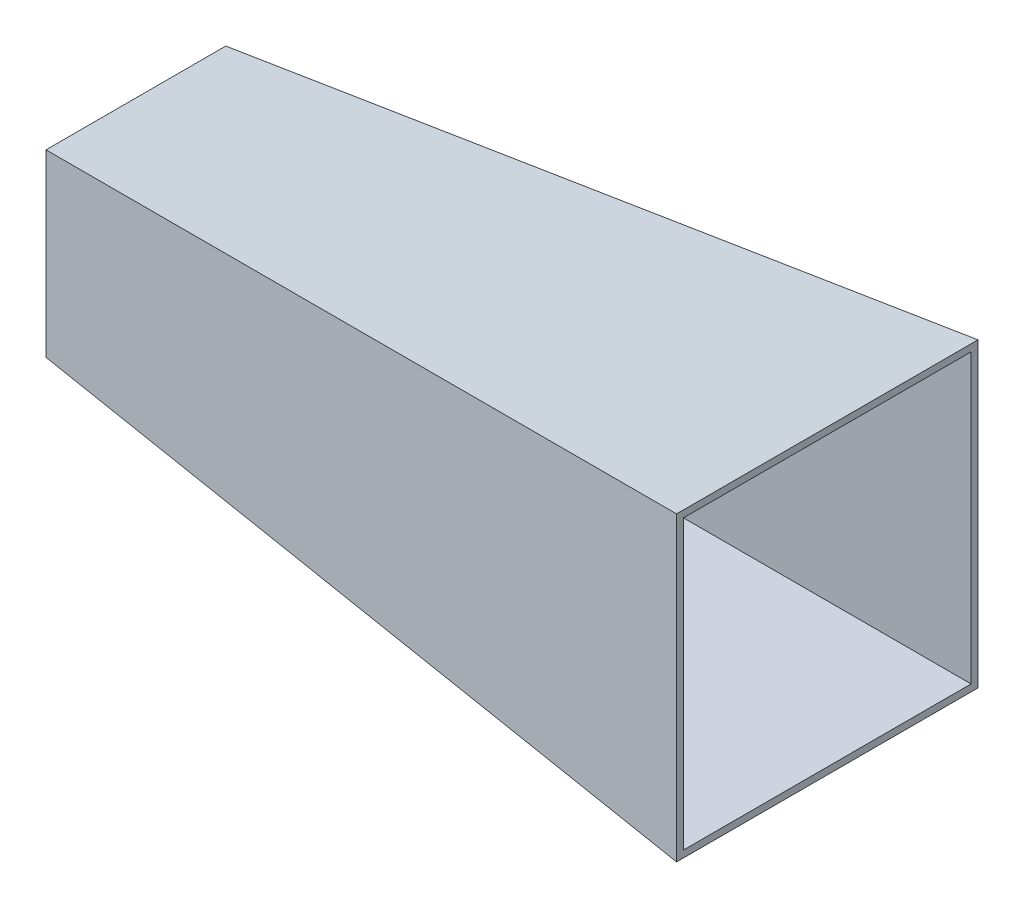
ISO-10303-21;
HEADER;
FILE_DESCRIPTION(('STEP AP214'),'2;1');
FILE_NAME('part.step','',(''),(''),'','','');
FILE_SCHEMA(('AUTOMOTIVE_DESIGN { 1 0 10303 214 1 1 1 1 }'));
ENDSEC;
DATA;
#1=APPLICATION_CONTEXT('core data for automotive mechanical design processes');
#2=APPLICATION_PROTOCOL_DEFINITION('international standard','automotive_design',2000,#1);
#3=PRODUCT_CONTEXT('',#1,'mechanical');
#4=PRODUCT('Part','Part','',(#3));
#5=PRODUCT_RELATED_PRODUCT_CATEGORY('part','',(#4));
#6=PRODUCT_DEFINITION_FORMATION('','',#4);
#7=PRODUCT_DEFINITION_CONTEXT('part definition',#1,'design');
#8=PRODUCT_DEFINITION('design','',#6,#7);
#9=PRODUCT_DEFINITION_SHAPE('','',#8);
#10=(LENGTH_UNIT() NAMED_UNIT(*) SI_UNIT(.MILLI.,.METRE.));
#11=(NAMED_UNIT(*) PLANE_ANGLE_UNIT() SI_UNIT($,.RADIAN.));
#12=(NAMED_UNIT(*) SI_UNIT($,.STERADIAN.) SOLID_ANGLE_UNIT());
#13=UNCERTAINTY_MEASURE_WITH_UNIT(LENGTH_MEASURE(1.E-05),#10,'distance_accuracy_value','');
#14=(GEOMETRIC_REPRESENTATION_CONTEXT(3) GLOBAL_UNCERTAINTY_ASSIGNED_CONTEXT((#13)) GLOBAL_UNIT_ASSIGNED_CONTEXT((#10,
#11,#12)) REPRESENTATION_CONTEXT('',''));
#15=CARTESIAN_POINT('',(0.,0.,0.));
#16=DIRECTION('',(0.,0.,1.));
#17=DIRECTION('',(1.,0.,0.));
#18=AXIS2_PLACEMENT_3D('',#15,#16,#17);
#19=CARTESIAN_POINT('',(500.,0.,0.));
#20=DIRECTION('',(-1.,0.,0.));
#21=DIRECTION('',(0.,0.,1.));
#22=AXIS2_PLACEMENT_3D('',#19,#20,#21);
#23=PLANE('',#22);
#24=DIRECTION('',(0.,1.,0.));
#25=VECTOR('',#24,1.);
#26=CARTESIAN_POINT('',(500.,104.,104.));
#27=LINE('',#26,#25);
#28=CARTESIAN_POINT('',(500.,-104.,104.));
#29=VERTEX_POINT('',#28);
#30=CARTESIAN_POINT('',(500.,104.,104.));
#31=VERTEX_POINT('',#30);
#32=EDGE_CURVE('E132',#29,#31,#27,.T.);
#33=ORIENTED_EDGE('',*,*,#32,.T.);
#34=DIRECTION('',(0.,0.,-1.));
#35=VECTOR('',#34,1.);
#36=CARTESIAN_POINT('',(500.,104.,104.));
#37=LINE('',#36,#35);
#38=CARTESIAN_POINT('',(500.,104.,-104.));
#39=VERTEX_POINT('',#38);
#40=EDGE_CURVE('E181',#31,#39,#37,.T.);
#41=ORIENTED_EDGE('',*,*,#40,.T.);
#42=DIRECTION('',(0.,-1.,0.));
#43=VECTOR('',#42,1.);
#44=CARTESIAN_POINT('',(500.,104.,-104.));
#45=LINE('',#44,#43);
#46=CARTESIAN_POINT('',(500.,-104.,-104.));
#47=VERTEX_POINT('',#46);
#48=EDGE_CURVE('E170',#39,#47,#45,.T.);
#49=ORIENTED_EDGE('',*,*,#48,.T.);
#50=DIRECTION('',(0.,0.,1.));
#51=VECTOR('',#50,1.);
#52=CARTESIAN_POINT('',(500.,-104.,104.));
#53=LINE('',#52,#51);
#54=EDGE_CURVE('E167',#47,#29,#53,.T.);
#55=ORIENTED_EDGE('',*,*,#54,.T.);
#56=EDGE_LOOP('',(#33,#41,#49,#55));
#57=FACE_BOUND('',#56,.T.);
#58=DIRECTION('',(0.,0.,-1.));
#59=VECTOR('',#58,1.);
#60=CARTESIAN_POINT('',(500.,-109.,109.));
#61=LINE('',#60,#59);
#62=CARTESIAN_POINT('',(500.,-109.,109.));
#63=VERTEX_POINT('',#62);
#64=CARTESIAN_POINT('',(500.,-109.,-109.));
#65=VERTEX_POINT('',#64);
#66=EDGE_CURVE('E298',#63,#65,#61,.T.);
#67=ORIENTED_EDGE('',*,*,#66,.T.);
#68=DIRECTION('',(0.,-1.,0.));
#69=VECTOR('',#68,1.);
#70=CARTESIAN_POINT('',(500.,109.,-109.));
#71=LINE('',#70,#69);
#72=CARTESIAN_POINT('',(500.,109.,-109.));
#73=VERTEX_POINT('',#72);
#74=EDGE_CURVE('E287',#73,#65,#71,.T.);
#75=ORIENTED_EDGE('',*,*,#74,.F.);
#76=DIRECTION('',(0.,0.,-1.));
#77=VECTOR('',#76,1.);
#78=CARTESIAN_POINT('',(500.,109.,109.));
#79=LINE('',#78,#77);
#80=CARTESIAN_POINT('',(500.,109.,109.));
#81=VERTEX_POINT('',#80);
#82=EDGE_CURVE('E71',#81,#73,#79,.T.);
#83=ORIENTED_EDGE('',*,*,#82,.F.);
#84=DIRECTION('',(0.,-1.,0.));
#85=VECTOR('',#84,1.);
#86=CARTESIAN_POINT('',(500.,109.,109.));
#87=LINE('',#86,#85);
#88=EDGE_CURVE('E12',#81,#63,#87,.T.);
#89=ORIENTED_EDGE('',*,*,#88,.T.);
#90=EDGE_LOOP('',(#67,#75,#83,#89));
#91=FACE_BOUND('',#90,.T.);
#92=ADVANCED_FACE('F61',(#57,#91),#23,.F.);
#93=CARTESIAN_POINT('',(0.,0.,0.));
#94=DIRECTION('',(1.,0.,0.));
#95=DIRECTION('',(0.,0.,-1.));
#96=AXIS2_PLACEMENT_3D('',#93,#94,#95);
#97=PLANE('',#96);
#98=DIRECTION('',(0.,-1.,0.));
#99=VECTOR('',#98,1.);
#100=CARTESIAN_POINT('',(0.,60.,-60.));
#101=LINE('',#100,#99);
#102=CARTESIAN_POINT('',(0.,60.,-60.));
#103=VERTEX_POINT('',#102);
#104=CARTESIAN_POINT('',(0.,-60.,-60.));
#105=VERTEX_POINT('',#104);
#106=EDGE_CURVE('E87',#103,#105,#101,.T.);
#107=ORIENTED_EDGE('',*,*,#106,.F.);
#108=DIRECTION('',(0.,0.,-1.));
#109=VECTOR('',#108,1.);
#110=CARTESIAN_POINT('',(0.,60.,60.));
#111=LINE('',#110,#109);
#112=CARTESIAN_POINT('',(0.,60.,60.));
#113=VERTEX_POINT('',#112);
#114=EDGE_CURVE('E148',#113,#103,#111,.T.);
#115=ORIENTED_EDGE('',*,*,#114,.F.);
#116=DIRECTION('',(0.,1.,0.));
#117=VECTOR('',#116,1.);
#118=CARTESIAN_POINT('',(0.,60.,60.));
#119=LINE('',#118,#117);
#120=CARTESIAN_POINT('',(0.,-60.,60.));
#121=VERTEX_POINT('',#120);
#122=EDGE_CURVE('E129',#121,#113,#119,.T.);
#123=ORIENTED_EDGE('',*,*,#122,.F.);
#124=DIRECTION('',(0.,0.,1.));
#125=VECTOR('',#124,1.);
#126=CARTESIAN_POINT('',(0.,-60.,60.));
#127=LINE('',#126,#125);
#128=EDGE_CURVE('E139',#105,#121,#127,.T.);
#129=ORIENTED_EDGE('',*,*,#128,.F.);
#130=EDGE_LOOP('',(#107,#115,#123,#129));
#131=FACE_BOUND('',#130,.T.);
#132=DIRECTION('',(0.,-1.,0.));
#133=VECTOR('',#132,1.);
#134=CARTESIAN_POINT('',(0.,65.,65.));
#135=LINE('',#134,#133);
#136=CARTESIAN_POINT('',(0.,65.,65.));
#137=VERTEX_POINT('',#136);
#138=CARTESIAN_POINT('',(0.,-65.,65.));
#139=VERTEX_POINT('',#138);
#140=EDGE_CURVE('E175',#137,#139,#135,.T.);
#141=ORIENTED_EDGE('',*,*,#140,.F.);
#142=DIRECTION('',(0.,0.,-1.));
#143=VECTOR('',#142,1.);
#144=CARTESIAN_POINT('',(0.,65.,65.));
#145=LINE('',#144,#143);
#146=CARTESIAN_POINT('',(0.,65.,-65.));
#147=VERTEX_POINT('',#146);
#148=EDGE_CURVE('E203',#137,#147,#145,.T.);
#149=ORIENTED_EDGE('',*,*,#148,.T.);
#150=DIRECTION('',(0.,-1.,0.));
#151=VECTOR('',#150,1.);
#152=CARTESIAN_POINT('',(0.,65.,-65.));
#153=LINE('',#152,#151);
#154=CARTESIAN_POINT('',(0.,-65.,-65.));
#155=VERTEX_POINT('',#154);
#156=EDGE_CURVE('E245',#147,#155,#153,.T.);
#157=ORIENTED_EDGE('',*,*,#156,.T.);
#158=DIRECTION('',(0.,0.,-1.));
#159=VECTOR('',#158,1.);
#160=CARTESIAN_POINT('',(0.,-65.,65.));
#161=LINE('',#160,#159);
#162=EDGE_CURVE('E263',#139,#155,#161,.T.);
#163=ORIENTED_EDGE('',*,*,#162,.F.);
#164=EDGE_LOOP('',(#141,#149,#157,#163));
#165=FACE_BOUND('',#164,.T.);
#166=ADVANCED_FACE('F145',(#131,#165),#97,.F.);
#167=CARTESIAN_POINT('',(-5.67604470976755,64.5005080655404,0.));
#168=DIRECTION('',(-0.0876612303095137,0.996150344426293,0.));
#169=DIRECTION('',(-0.996150344426293,-0.0876612303095137,0.));
#170=AXIS2_PLACEMENT_3D('',#167,#168,#169);
#171=PLANE('',#170);
#172=DIRECTION('',(0.992344808811544,0.0873263431754158,0.0873263431754159));
#173=VECTOR('',#172,1.);
#174=CARTESIAN_POINT('',(0.,65.,65.));
#175=LINE('',#174,#173);
#176=EDGE_CURVE('E209',#137,#81,#175,.T.);
#177=ORIENTED_EDGE('',*,*,#176,.T.);
#178=ORIENTED_EDGE('',*,*,#82,.T.);
#179=DIRECTION('',(0.992344808811544,0.0873263431754158,-0.0873263431754157));
#180=VECTOR('',#179,1.);
#181=CARTESIAN_POINT('',(0.,65.,-65.));
#182=LINE('',#181,#180);
#183=EDGE_CURVE('E331',#147,#73,#182,.T.);
#184=ORIENTED_EDGE('',*,*,#183,.F.);
#185=ORIENTED_EDGE('',*,*,#148,.F.);
#186=EDGE_LOOP('',(#177,#178,#184,#185));
#187=FACE_BOUND('',#186,.T.);
#188=ADVANCED_FACE('F211',(#187),#171,.T.);
#189=CARTESIAN_POINT('',(-5.67604470976755,0.,-64.5005080655405));
#190=DIRECTION('',(-0.0876612303095136,0.,-0.996150344426293));
#191=DIRECTION('',(-0.996150344426293,0.,0.0876612303095136));
#192=AXIS2_PLACEMENT_3D('',#189,#190,#191);
#193=PLANE('',#192);
#194=ORIENTED_EDGE('',*,*,#183,.T.);
#195=ORIENTED_EDGE('',*,*,#74,.T.);
#196=DIRECTION('',(0.992344808811544,-0.0873263431754158,-0.0873263431754157));
#197=VECTOR('',#196,1.);
#198=CARTESIAN_POINT('',(0.,-65.,-65.));
#199=LINE('',#198,#197);
#200=EDGE_CURVE('E320',#155,#65,#199,.T.);
#201=ORIENTED_EDGE('',*,*,#200,.F.);
#202=ORIENTED_EDGE('',*,*,#156,.F.);
#203=EDGE_LOOP('',(#194,#195,#201,#202));
#204=FACE_BOUND('',#203,.T.);
#205=ADVANCED_FACE('F221',(#204),#193,.T.);
#206=CARTESIAN_POINT('',(-5.67604470976756,0.,64.5005080655405));
#207=DIRECTION('',(0.0876612303095139,0.,-0.996150344426293));
#208=DIRECTION('',(-0.996150344426293,0.,-0.0876612303095139));
#209=AXIS2_PLACEMENT_3D('',#206,#207,#208);
#210=PLANE('',#209);
#211=DIRECTION('',(0.992344808811544,-0.0873263431754158,0.0873263431754159));
#212=VECTOR('',#211,1.);
#213=CARTESIAN_POINT('',(0.,-65.,65.));
#214=LINE('',#213,#212);
#215=EDGE_CURVE('E323',#139,#63,#214,.T.);
#216=ORIENTED_EDGE('',*,*,#215,.T.);
#217=ORIENTED_EDGE('',*,*,#88,.F.);
#218=ORIENTED_EDGE('',*,*,#176,.F.);
#219=ORIENTED_EDGE('',*,*,#140,.T.);
#220=EDGE_LOOP('',(#216,#217,#218,#219));
#221=FACE_BOUND('',#220,.T.);
#222=ADVANCED_FACE('F350',(#221),#210,.F.);
#223=CARTESIAN_POINT('',(-5.67604470976756,-64.5005080655405,0.));
#224=DIRECTION('',(0.0876612303095138,0.996150344426293,0.));
#225=DIRECTION('',(-0.996150344426293,0.0876612303095138,0.));
#226=AXIS2_PLACEMENT_3D('',#223,#224,#225);
#227=PLANE('',#226);
#228=ORIENTED_EDGE('',*,*,#200,.T.);
#229=ORIENTED_EDGE('',*,*,#66,.F.);
#230=ORIENTED_EDGE('',*,*,#215,.F.);
#231=ORIENTED_EDGE('',*,*,#162,.T.);
#232=EDGE_LOOP('',(#228,#229,#230,#231));
#233=FACE_BOUND('',#232,.T.);
#234=ADVANCED_FACE('F358',(#233),#227,.F.);
#235=CARTESIAN_POINT('',(-5.23942588593929,59.5389305220374,0.));
#236=DIRECTION('',(-0.0876612303095138,0.996150344426293,0.));
#237=DIRECTION('',(-0.996150344426293,-0.0876612303095138,0.));
#238=AXIS2_PLACEMENT_3D('',#235,#236,#237);
#239=PLANE('',#238);
#240=DIRECTION('',(0.992344808811544,0.0873263431754158,0.0873263431754158));
#241=VECTOR('',#240,1.);
#242=CARTESIAN_POINT('',(0.,60.,60.));
#243=LINE('',#242,#241);
#244=EDGE_CURVE('E150',#113,#31,#243,.T.);
#245=ORIENTED_EDGE('',*,*,#244,.F.);
#246=ORIENTED_EDGE('',*,*,#114,.T.);
#247=DIRECTION('',(0.992344808811544,0.0873263431754158,-0.0873263431754158));
#248=VECTOR('',#247,1.);
#249=CARTESIAN_POINT('',(0.,60.,-60.));
#250=LINE('',#249,#248);
#251=EDGE_CURVE('E136',#103,#39,#250,.T.);
#252=ORIENTED_EDGE('',*,*,#251,.T.);
#253=ORIENTED_EDGE('',*,*,#40,.F.);
#254=EDGE_LOOP('',(#245,#246,#252,#253));
#255=FACE_BOUND('',#254,.T.);
#256=ADVANCED_FACE('F415',(#255),#239,.F.);
#257=CARTESIAN_POINT('',(-5.23942588593928,0.,-59.5389305220373));
#258=DIRECTION('',(-0.0876612303095137,0.,-0.996150344426293));
#259=DIRECTION('',(-0.996150344426293,0.,0.0876612303095137));
#260=AXIS2_PLACEMENT_3D('',#257,#258,#259);
#261=PLANE('',#260);
#262=ORIENTED_EDGE('',*,*,#251,.F.);
#263=ORIENTED_EDGE('',*,*,#106,.T.);
#264=DIRECTION('',(0.992344808811544,-0.0873263431754158,-0.0873263431754158));
#265=VECTOR('',#264,1.);
#266=CARTESIAN_POINT('',(0.,-60.,-60.));
#267=LINE('',#266,#265);
#268=EDGE_CURVE('E135',#105,#47,#267,.T.);
#269=ORIENTED_EDGE('',*,*,#268,.T.);
#270=ORIENTED_EDGE('',*,*,#48,.F.);
#271=EDGE_LOOP('',(#262,#263,#269,#270));
#272=FACE_BOUND('',#271,.T.);
#273=ADVANCED_FACE('F413',(#272),#261,.F.);
#274=CARTESIAN_POINT('',(-5.23942588593929,0.,59.5389305220374));
#275=DIRECTION('',(-0.0876612303095138,0.,0.996150344426293));
#276=DIRECTION('',(0.996150344426293,0.,0.0876612303095138));
#277=AXIS2_PLACEMENT_3D('',#274,#275,#276);
#278=PLANE('',#277);
#279=DIRECTION('',(0.992344808811544,-0.0873263431754157,0.0873263431754158));
#280=VECTOR('',#279,1.);
#281=CARTESIAN_POINT('',(0.,-60.,60.));
#282=LINE('',#281,#280);
#283=EDGE_CURVE('E79',#121,#29,#282,.T.);
#284=ORIENTED_EDGE('',*,*,#283,.F.);
#285=ORIENTED_EDGE('',*,*,#122,.T.);
#286=ORIENTED_EDGE('',*,*,#244,.T.);
#287=ORIENTED_EDGE('',*,*,#32,.F.);
#288=EDGE_LOOP('',(#284,#285,#286,#287));
#289=FACE_BOUND('',#288,.T.);
#290=ADVANCED_FACE('F127',(#289),#278,.F.);
#291=CARTESIAN_POINT('',(-5.23942588593928,-59.5389305220373,0.));
#292=DIRECTION('',(-0.0876612303095138,-0.996150344426293,0.));
#293=DIRECTION('',(0.996150344426293,-0.0876612303095138,0.));
#294=AXIS2_PLACEMENT_3D('',#291,#292,#293);
#295=PLANE('',#294);
#296=ORIENTED_EDGE('',*,*,#268,.F.);
#297=ORIENTED_EDGE('',*,*,#128,.T.);
#298=ORIENTED_EDGE('',*,*,#283,.T.);
#299=ORIENTED_EDGE('',*,*,#54,.F.);
#300=EDGE_LOOP('',(#296,#297,#298,#299));
#301=FACE_BOUND('',#300,.T.);
#302=ADVANCED_FACE('F140',(#301),#295,.F.);
#303=CLOSED_SHELL('',(#92,#166,#188,#205,#222,#234,#256,#273,#290,#302));
#304=MANIFOLD_SOLID_BREP('B2',#303);
#305=ADVANCED_BREP_SHAPE_REPRESENTATION('',(#18,#304),#14);
#306=SHAPE_DEFINITION_REPRESENTATION(#9,#305);
ENDSEC;
END-ISO-10303-21;
